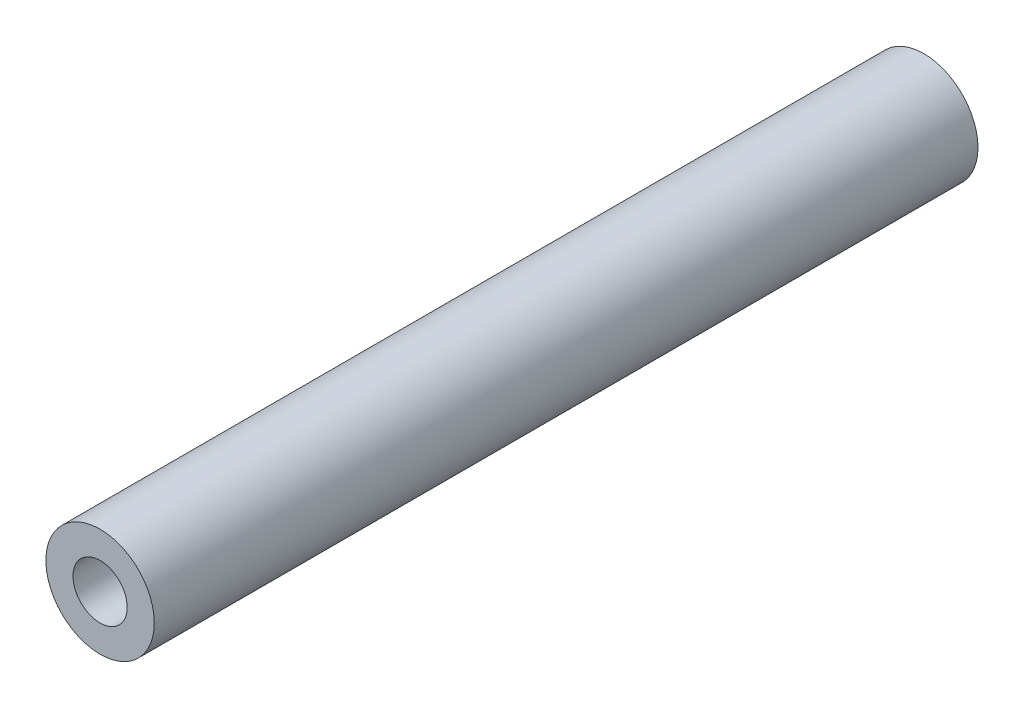
ISO-10303-21;
HEADER;
FILE_DESCRIPTION(('STEP AP214'),'2;1');
FILE_NAME('part.step','',(''),(''),'','','');
FILE_SCHEMA(('AUTOMOTIVE_DESIGN { 1 0 10303 214 1 1 1 1 }'));
ENDSEC;
DATA;
#1=APPLICATION_CONTEXT('core data for automotive mechanical design processes');
#2=APPLICATION_PROTOCOL_DEFINITION('international standard','automotive_design',2000,#1);
#3=PRODUCT_CONTEXT('',#1,'mechanical');
#4=PRODUCT('Part','Part','',(#3));
#5=PRODUCT_RELATED_PRODUCT_CATEGORY('part','',(#4));
#6=PRODUCT_DEFINITION_FORMATION('','',#4);
#7=PRODUCT_DEFINITION_CONTEXT('part definition',#1,'design');
#8=PRODUCT_DEFINITION('design','',#6,#7);
#9=PRODUCT_DEFINITION_SHAPE('','',#8);
#10=(LENGTH_UNIT() NAMED_UNIT(*) SI_UNIT(.MILLI.,.METRE.));
#11=(NAMED_UNIT(*) PLANE_ANGLE_UNIT() SI_UNIT($,.RADIAN.));
#12=(NAMED_UNIT(*) SI_UNIT($,.STERADIAN.) SOLID_ANGLE_UNIT());
#13=UNCERTAINTY_MEASURE_WITH_UNIT(LENGTH_MEASURE(1.E-05),#10,'distance_accuracy_value','');
#14=(GEOMETRIC_REPRESENTATION_CONTEXT(3) GLOBAL_UNCERTAINTY_ASSIGNED_CONTEXT((#13)) GLOBAL_UNIT_ASSIGNED_CONTEXT((#10,
#11,#12)) REPRESENTATION_CONTEXT('',''));
#15=CARTESIAN_POINT('',(0.,0.,0.));
#16=DIRECTION('',(0.,0.,1.));
#17=DIRECTION('',(1.,0.,0.));
#18=AXIS2_PLACEMENT_3D('',#15,#16,#17);
#19=CARTESIAN_POINT('',(0.,0.,38.));
#20=DIRECTION('',(0.,0.,-1.));
#21=DIRECTION('',(-1.,0.,0.));
#22=AXIS2_PLACEMENT_3D('',#19,#20,#21);
#23=CYLINDRICAL_SURFACE('',#22,2.5);
#24=CARTESIAN_POINT('',(0.,0.,38.));
#25=DIRECTION('',(0.,0.,1.));
#26=DIRECTION('',(1.,0.,0.));
#27=AXIS2_PLACEMENT_3D('',#24,#25,#26);
#28=CIRCLE('',#27,2.5);
#29=CARTESIAN_POINT('',(2.5,0.,38.));
#30=VERTEX_POINT('',#29);
#31=EDGE_CURVE('E10',#30,#30,#28,.T.);
#32=ORIENTED_EDGE('',*,*,#31,.F.);
#33=EDGE_LOOP('',(#32));
#34=FACE_BOUND('',#33,.T.);
#35=CARTESIAN_POINT('',(0.,0.,0.));
#36=DIRECTION('',(0.,0.,1.));
#37=DIRECTION('',(1.,0.,0.));
#38=AXIS2_PLACEMENT_3D('',#35,#36,#37);
#39=CIRCLE('',#38,2.5);
#40=CARTESIAN_POINT('',(2.5,0.,0.));
#41=VERTEX_POINT('',#40);
#42=EDGE_CURVE('E46',#41,#41,#39,.T.);
#43=ORIENTED_EDGE('',*,*,#42,.T.);
#44=EDGE_LOOP('',(#43));
#45=FACE_BOUND('',#44,.T.);
#46=ADVANCED_FACE('F43',(#34,#45),#23,.T.);
#47=CARTESIAN_POINT('',(0.,0.,38.));
#48=DIRECTION('',(0.,0.,1.));
#49=DIRECTION('',(1.,0.,0.));
#50=AXIS2_PLACEMENT_3D('',#47,#48,#49);
#51=PLANE('',#50);
#52=CARTESIAN_POINT('',(0.,0.,38.));
#53=DIRECTION('',(0.,0.,1.));
#54=DIRECTION('',(1.,0.,0.));
#55=AXIS2_PLACEMENT_3D('',#52,#53,#54);
#56=CIRCLE('',#55,1.25);
#57=CARTESIAN_POINT('',(1.25,0.,38.));
#58=VERTEX_POINT('',#57);
#59=EDGE_CURVE('E57',#58,#58,#56,.T.);
#60=ORIENTED_EDGE('',*,*,#59,.F.);
#61=EDGE_LOOP('',(#60));
#62=FACE_BOUND('',#61,.T.);
#63=ORIENTED_EDGE('',*,*,#31,.T.);
#64=EDGE_LOOP('',(#63));
#65=FACE_BOUND('',#64,.T.);
#66=ADVANCED_FACE('F63',(#62,#65),#51,.T.);
#67=CARTESIAN_POINT('',(0.,0.,0.));
#68=DIRECTION('',(0.,0.,1.));
#69=DIRECTION('',(1.,0.,0.));
#70=AXIS2_PLACEMENT_3D('',#67,#68,#69);
#71=PLANE('',#70);
#72=CARTESIAN_POINT('',(0.,0.,0.));
#73=DIRECTION('',(0.,0.,1.));
#74=DIRECTION('',(1.,0.,0.));
#75=AXIS2_PLACEMENT_3D('',#72,#73,#74);
#76=CIRCLE('',#75,1.24999999999999);
#77=CARTESIAN_POINT('',(1.24999999999999,0.,0.));
#78=VERTEX_POINT('',#77);
#79=EDGE_CURVE('E53',#78,#78,#76,.T.);
#80=ORIENTED_EDGE('',*,*,#79,.T.);
#81=EDGE_LOOP('',(#80));
#82=FACE_BOUND('',#81,.T.);
#83=ORIENTED_EDGE('',*,*,#42,.F.);
#84=EDGE_LOOP('',(#83));
#85=FACE_BOUND('',#84,.T.);
#86=ADVANCED_FACE('F65',(#82,#85),#71,.F.);
#87=CARTESIAN_POINT('',(0.,0.,38.));
#88=DIRECTION('',(0.,0.,1.));
#89=DIRECTION('',(1.,0.,0.));
#90=AXIS2_PLACEMENT_3D('',#87,#88,#89);
#91=CYLINDRICAL_SURFACE('',#90,1.24999999999999);
#92=ORIENTED_EDGE('',*,*,#79,.F.);
#93=EDGE_LOOP('',(#92));
#94=FACE_BOUND('',#93,.T.);
#95=ORIENTED_EDGE('',*,*,#59,.T.);
#96=EDGE_LOOP('',(#95));
#97=FACE_BOUND('',#96,.T.);
#98=ADVANCED_FACE('F61',(#94,#97),#91,.F.);
#99=CLOSED_SHELL('',(#46,#66,#86,#98));
#100=MANIFOLD_SOLID_BREP('B2',#99);
#101=ADVANCED_BREP_SHAPE_REPRESENTATION('',(#18,#100),#14);
#102=SHAPE_DEFINITION_REPRESENTATION(#9,#101);
ENDSEC;
END-ISO-10303-21;
